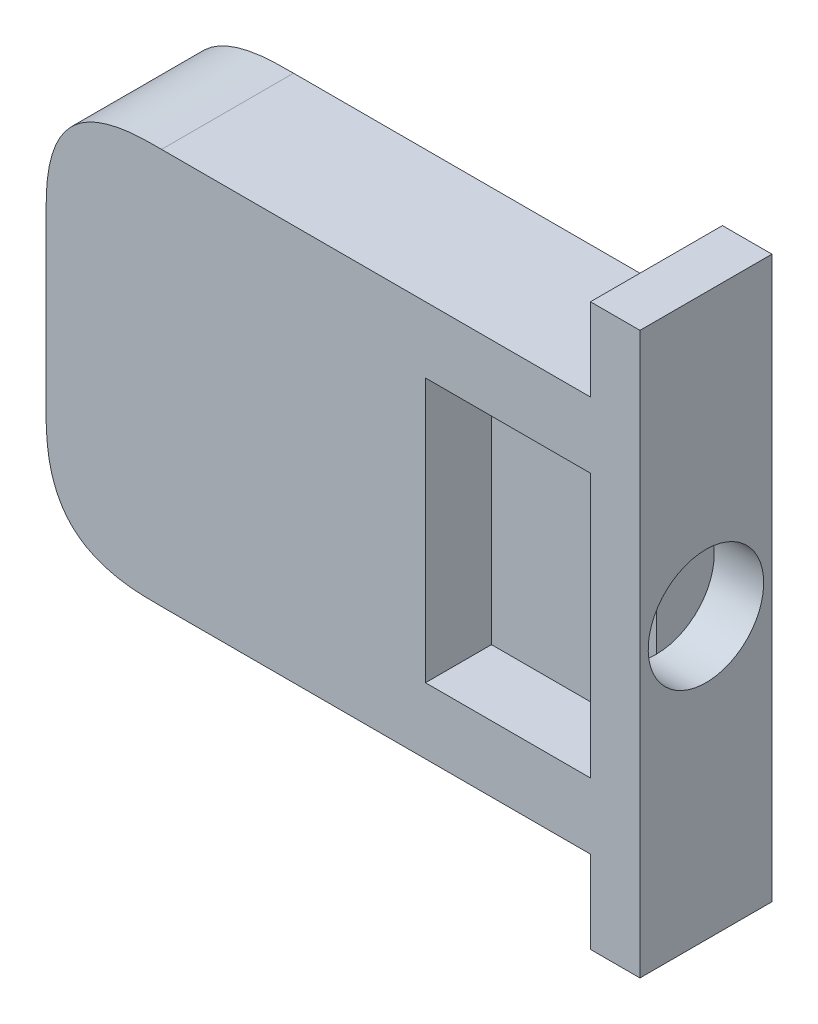
ISO-10303-21;
HEADER;
FILE_DESCRIPTION(('STEP AP214'),'2;1');
FILE_NAME('part.step','',(''),(''),'','','');
FILE_SCHEMA(('AUTOMOTIVE_DESIGN { 1 0 10303 214 1 1 1 1 }'));
ENDSEC;
DATA;
#1=APPLICATION_CONTEXT('core data for automotive mechanical design processes');
#2=APPLICATION_PROTOCOL_DEFINITION('international standard','automotive_design',2000,#1);
#3=PRODUCT_CONTEXT('',#1,'mechanical');
#4=PRODUCT('Part','Part','',(#3));
#5=PRODUCT_RELATED_PRODUCT_CATEGORY('part','',(#4));
#6=PRODUCT_DEFINITION_FORMATION('','',#4);
#7=PRODUCT_DEFINITION_CONTEXT('part definition',#1,'design');
#8=PRODUCT_DEFINITION('design','',#6,#7);
#9=PRODUCT_DEFINITION_SHAPE('','',#8);
#10=(LENGTH_UNIT() NAMED_UNIT(*) SI_UNIT(.MILLI.,.METRE.));
#11=(NAMED_UNIT(*) PLANE_ANGLE_UNIT() SI_UNIT($,.RADIAN.));
#12=(NAMED_UNIT(*) SI_UNIT($,.STERADIAN.) SOLID_ANGLE_UNIT());
#13=UNCERTAINTY_MEASURE_WITH_UNIT(LENGTH_MEASURE(1.E-05),#10,'distance_accuracy_value','');
#14=(GEOMETRIC_REPRESENTATION_CONTEXT(3) GLOBAL_UNCERTAINTY_ASSIGNED_CONTEXT((#13)) GLOBAL_UNIT_ASSIGNED_CONTEXT((#10,
#11,#12)) REPRESENTATION_CONTEXT('',''));
#15=CARTESIAN_POINT('',(0.,0.,0.));
#16=DIRECTION('',(0.,0.,1.));
#17=DIRECTION('',(1.,0.,0.));
#18=AXIS2_PLACEMENT_3D('',#15,#16,#17);
#19=CARTESIAN_POINT('',(0.,0.,8.));
#20=DIRECTION('',(0.,0.,-1.));
#21=DIRECTION('',(-1.,0.,0.));
#22=AXIS2_PLACEMENT_3D('',#19,#20,#21);
#23=PLANE('',#22);
#24=DIRECTION('',(1.,0.,0.));
#25=VECTOR('',#24,1.);
#26=CARTESIAN_POINT('',(-6.,12.,8.));
#27=LINE('',#26,#25);
#28=CARTESIAN_POINT('',(0.999999999999998,12.,8.));
#29=VERTEX_POINT('',#28);
#30=CARTESIAN_POINT('',(27.,12.,8.));
#31=VERTEX_POINT('',#30);
#32=EDGE_CURVE('E432',#29,#31,#27,.T.);
#33=ORIENTED_EDGE('',*,*,#32,.F.);
#34=CARTESIAN_POINT('',(-6.,5.,8.));
#35=CARTESIAN_POINT('',(-6.,6.17738636073763,8.));
#36=CARTESIAN_POINT('',(-6.,7.35477272147525,8.));
#37=CARTESIAN_POINT('',(-5.49815656114742,9.94974746830584,8.));
#38=CARTESIAN_POINT('',(-3.94974746830583,11.4981565611474,8.));
#39=CARTESIAN_POINT('',(-1.35477272147525,12.,8.));
#40=CARTESIAN_POINT('',(-0.177386360737627,12.,8.));
#41=CARTESIAN_POINT('',(0.999999999999998,12.,8.));
#42=B_SPLINE_CURVE_WITH_KNOTS('',5,(#34,#35,#36,#37,#38,#39,#40,#41),.UNSPECIFIED.,.F.,.F.,(6,2,
6),(0.,0.5,1.),.UNSPECIFIED.);
#43=CARTESIAN_POINT('',(-6.,5.,8.));
#44=VERTEX_POINT('',#43);
#45=EDGE_CURVE('E53',#29,#44,#42,.F.);
#46=ORIENTED_EDGE('',*,*,#45,.T.);
#47=DIRECTION('',(0.,1.,0.));
#48=VECTOR('',#47,1.);
#49=CARTESIAN_POINT('',(-6.,-12.,8.));
#50=LINE('',#49,#48);
#51=CARTESIAN_POINT('',(-6.,-5.,8.));
#52=VERTEX_POINT('',#51);
#53=EDGE_CURVE('E222',#52,#44,#50,.T.);
#54=ORIENTED_EDGE('',*,*,#53,.F.);
#55=CARTESIAN_POINT('',(0.999999999999998,-12.,8.));
#56=CARTESIAN_POINT('',(-0.177386360737628,-12.,8.));
#57=CARTESIAN_POINT('',(-1.35477272147525,-12.,8.));
#58=CARTESIAN_POINT('',(-3.94974746830584,-11.4981565611474,8.));
#59=CARTESIAN_POINT('',(-5.49815656114742,-9.94974746830584,8.));
#60=CARTESIAN_POINT('',(-6.,-7.35477272147525,8.));
#61=CARTESIAN_POINT('',(-6.,-6.17738636073763,8.));
#62=CARTESIAN_POINT('',(-6.,-5.,8.));
#63=B_SPLINE_CURVE_WITH_KNOTS('',5,(#55,#56,#57,#58,#59,#60,#61,#62),.UNSPECIFIED.,.F.,.F.,(6,2,
6),(0.,0.5,1.),.UNSPECIFIED.);
#64=CARTESIAN_POINT('',(0.999999999999998,-12.,8.));
#65=VERTEX_POINT('',#64);
#66=EDGE_CURVE('E231',#52,#65,#63,.F.);
#67=ORIENTED_EDGE('',*,*,#66,.T.);
#68=DIRECTION('',(1.,0.,0.));
#69=VECTOR('',#68,1.);
#70=CARTESIAN_POINT('',(-6.,-12.,8.));
#71=LINE('',#70,#69);
#72=CARTESIAN_POINT('',(27.,-12.,8.));
#73=VERTEX_POINT('',#72);
#74=EDGE_CURVE('E214',#65,#73,#71,.T.);
#75=ORIENTED_EDGE('',*,*,#74,.T.);
#76=DIRECTION('',(0.,-1.,0.));
#77=VECTOR('',#76,1.);
#78=CARTESIAN_POINT('',(27.,-12.,8.));
#79=LINE('',#78,#77);
#80=CARTESIAN_POINT('',(27.,-17.,8.));
#81=VERTEX_POINT('',#80);
#82=EDGE_CURVE('E212',#73,#81,#79,.T.);
#83=ORIENTED_EDGE('',*,*,#82,.T.);
#84=DIRECTION('',(1.,0.,0.));
#85=VECTOR('',#84,1.);
#86=CARTESIAN_POINT('',(27.,-17.,8.));
#87=LINE('',#86,#85);
#88=CARTESIAN_POINT('',(30.,-17.,8.));
#89=VERTEX_POINT('',#88);
#90=EDGE_CURVE('E210',#81,#89,#87,.T.);
#91=ORIENTED_EDGE('',*,*,#90,.T.);
#92=DIRECTION('',(0.,-1.,0.));
#93=VECTOR('',#92,1.);
#94=CARTESIAN_POINT('',(30.,17.,8.));
#95=LINE('',#94,#93);
#96=CARTESIAN_POINT('',(30.,17.,8.));
#97=VERTEX_POINT('',#96);
#98=EDGE_CURVE('E206',#97,#89,#95,.T.);
#99=ORIENTED_EDGE('',*,*,#98,.F.);
#100=DIRECTION('',(1.,0.,0.));
#101=VECTOR('',#100,1.);
#102=CARTESIAN_POINT('',(27.,17.,8.));
#103=LINE('',#102,#101);
#104=CARTESIAN_POINT('',(27.,17.,8.));
#105=VERTEX_POINT('',#104);
#106=EDGE_CURVE('E203',#105,#97,#103,.T.);
#107=ORIENTED_EDGE('',*,*,#106,.F.);
#108=DIRECTION('',(0.,1.,0.));
#109=VECTOR('',#108,1.);
#110=CARTESIAN_POINT('',(27.,12.,8.));
#111=LINE('',#110,#109);
#112=EDGE_CURVE('E400',#31,#105,#111,.T.);
#113=ORIENTED_EDGE('',*,*,#112,.F.);
#114=EDGE_LOOP('',(#33,#46,#54,#67,#75,#83,#91,#99,#107,#113));
#115=FACE_BOUND('',#114,.T.);
#116=DIRECTION('',(0.,-1.,0.));
#117=VECTOR('',#116,1.);
#118=CARTESIAN_POINT('',(27.,0.,8.));
#119=LINE('',#118,#117);
#120=CARTESIAN_POINT('',(27.,8.,8.));
#121=VERTEX_POINT('',#120);
#122=CARTESIAN_POINT('',(27.,-8.,8.));
#123=VERTEX_POINT('',#122);
#124=EDGE_CURVE('E67',#121,#123,#119,.T.);
#125=ORIENTED_EDGE('',*,*,#124,.T.);
#126=DIRECTION('',(1.,0.,0.));
#127=VECTOR('',#126,1.);
#128=CARTESIAN_POINT('',(0.,-8.,8.));
#129=LINE('',#128,#127);
#130=CARTESIAN_POINT('',(17.,-8.,8.));
#131=VERTEX_POINT('',#130);
#132=EDGE_CURVE('E174',#131,#123,#129,.T.);
#133=ORIENTED_EDGE('',*,*,#132,.F.);
#134=DIRECTION('',(0.,1.,0.));
#135=VECTOR('',#134,1.);
#136=CARTESIAN_POINT('',(17.,0.,8.));
#137=LINE('',#136,#135);
#138=CARTESIAN_POINT('',(17.,8.,8.));
#139=VERTEX_POINT('',#138);
#140=EDGE_CURVE('E176',#131,#139,#137,.T.);
#141=ORIENTED_EDGE('',*,*,#140,.T.);
#142=DIRECTION('',(1.,0.,0.));
#143=VECTOR('',#142,1.);
#144=CARTESIAN_POINT('',(0.,8.,8.));
#145=LINE('',#144,#143);
#146=EDGE_CURVE('E190',#139,#121,#145,.T.);
#147=ORIENTED_EDGE('',*,*,#146,.T.);
#148=EDGE_LOOP('',(#125,#133,#141,#147));
#149=FACE_BOUND('',#148,.T.);
#150=ADVANCED_FACE('F39',(#115,#149),#23,.F.);
#151=CARTESIAN_POINT('',(27.,17.,8.));
#152=DIRECTION('',(0.,1.,0.));
#153=DIRECTION('',(0.,0.,1.));
#154=AXIS2_PLACEMENT_3D('',#151,#152,#153);
#155=PLANE('',#154);
#156=DIRECTION('',(1.,0.,0.));
#157=VECTOR('',#156,1.);
#158=CARTESIAN_POINT('',(27.,17.,0.));
#159=LINE('',#158,#157);
#160=CARTESIAN_POINT('',(27.,17.,0.));
#161=VERTEX_POINT('',#160);
#162=CARTESIAN_POINT('',(30.,17.,0.));
#163=VERTEX_POINT('',#162);
#164=EDGE_CURVE('E197',#161,#163,#159,.T.);
#165=ORIENTED_EDGE('',*,*,#164,.F.);
#166=DIRECTION('',(0.,0.,-1.));
#167=VECTOR('',#166,1.);
#168=CARTESIAN_POINT('',(27.,17.,8.));
#169=LINE('',#168,#167);
#170=EDGE_CURVE('E377',#105,#161,#169,.T.);
#171=ORIENTED_EDGE('',*,*,#170,.F.);
#172=ORIENTED_EDGE('',*,*,#106,.T.);
#173=DIRECTION('',(0.,0.,-1.));
#174=VECTOR('',#173,1.);
#175=CARTESIAN_POINT('',(30.,17.,8.));
#176=LINE('',#175,#174);
#177=EDGE_CURVE('E398',#97,#163,#176,.T.);
#178=ORIENTED_EDGE('',*,*,#177,.T.);
#179=EDGE_LOOP('',(#165,#171,#172,#178));
#180=FACE_BOUND('',#179,.T.);
#181=ADVANCED_FACE('F247',(#180),#155,.T.);
#182=CARTESIAN_POINT('',(27.,12.,8.));
#183=DIRECTION('',(-1.,0.,0.));
#184=DIRECTION('',(0.,0.,1.));
#185=AXIS2_PLACEMENT_3D('',#182,#183,#184);
#186=PLANE('',#185);
#187=DIRECTION('',(0.,1.,0.));
#188=VECTOR('',#187,1.);
#189=CARTESIAN_POINT('',(27.,12.,0.));
#190=LINE('',#189,#188);
#191=CARTESIAN_POINT('',(27.,12.,0.));
#192=VERTEX_POINT('',#191);
#193=EDGE_CURVE('E207',#192,#161,#190,.T.);
#194=ORIENTED_EDGE('',*,*,#193,.F.);
#195=DIRECTION('',(0.,0.,-1.));
#196=VECTOR('',#195,1.);
#197=CARTESIAN_POINT('',(27.,12.,8.));
#198=LINE('',#197,#196);
#199=EDGE_CURVE('E379',#31,#192,#198,.T.);
#200=ORIENTED_EDGE('',*,*,#199,.F.);
#201=ORIENTED_EDGE('',*,*,#112,.T.);
#202=ORIENTED_EDGE('',*,*,#170,.T.);
#203=EDGE_LOOP('',(#194,#200,#201,#202));
#204=FACE_BOUND('',#203,.T.);
#205=ADVANCED_FACE('F295',(#204),#186,.T.);
#206=CARTESIAN_POINT('',(-6.,12.,8.));
#207=DIRECTION('',(0.,1.,0.));
#208=DIRECTION('',(0.,0.,1.));
#209=AXIS2_PLACEMENT_3D('',#206,#207,#208);
#210=PLANE('',#209);
#211=DIRECTION('',(1.,0.,0.));
#212=VECTOR('',#211,1.);
#213=CARTESIAN_POINT('',(-6.,12.,0.));
#214=LINE('',#213,#212);
#215=CARTESIAN_POINT('',(0.999999999999998,12.,0.));
#216=VERTEX_POINT('',#215);
#217=EDGE_CURVE('E405',#216,#192,#214,.T.);
#218=ORIENTED_EDGE('',*,*,#217,.F.);
#219=CARTESIAN_POINT('',(0.999999999999998,12.,8.4));
#220=CARTESIAN_POINT('',(0.999999999999998,12.,5.46666666666889));
#221=CARTESIAN_POINT('',(0.999999999999998,12.,2.53333333333333));
#222=CARTESIAN_POINT('',(0.999999999999998,12.,-0.400000000000001));
#223=B_SPLINE_CURVE_WITH_KNOTS('',3,(#219,#220,#221,#222),.UNSPECIFIED.,.F.,.F.,(4,4),(-0.0004,
0.0084),.UNSPECIFIED.);
#224=EDGE_CURVE('E333',#216,#29,#223,.F.);
#225=ORIENTED_EDGE('',*,*,#224,.T.);
#226=ORIENTED_EDGE('',*,*,#32,.T.);
#227=ORIENTED_EDGE('',*,*,#199,.T.);
#228=EDGE_LOOP('',(#218,#225,#226,#227));
#229=FACE_BOUND('',#228,.T.);
#230=ADVANCED_FACE('F467',(#229),#210,.T.);
#231=CARTESIAN_POINT('',(-6.,-12.,8.));
#232=DIRECTION('',(-1.,0.,0.));
#233=DIRECTION('',(0.,0.,1.));
#234=AXIS2_PLACEMENT_3D('',#231,#232,#233);
#235=PLANE('',#234);
#236=ORIENTED_EDGE('',*,*,#53,.T.);
#237=CARTESIAN_POINT('',(-6.,5.,-0.400000000000001));
#238=CARTESIAN_POINT('',(-6.,5.,2.53333333333333));
#239=CARTESIAN_POINT('',(-6.,5.,5.46666666666889));
#240=CARTESIAN_POINT('',(-6.,5.,8.4));
#241=B_SPLINE_CURVE_WITH_KNOTS('',3,(#237,#238,#239,#240),.UNSPECIFIED.,.F.,.F.,(4,4),
(-0.000399999999999999,0.0084),.UNSPECIFIED.);
#242=CARTESIAN_POINT('',(-6.,5.,0.));
#243=VERTEX_POINT('',#242);
#244=EDGE_CURVE('E376',#44,#243,#241,.F.);
#245=ORIENTED_EDGE('',*,*,#244,.T.);
#246=DIRECTION('',(0.,1.,0.));
#247=VECTOR('',#246,1.);
#248=CARTESIAN_POINT('',(-6.,-12.,0.));
#249=LINE('',#248,#247);
#250=CARTESIAN_POINT('',(-6.,-5.,0.));
#251=VERTEX_POINT('',#250);
#252=EDGE_CURVE('E401',#251,#243,#249,.T.);
#253=ORIENTED_EDGE('',*,*,#252,.F.);
#254=CARTESIAN_POINT('',(-6.,-5.,8.4));
#255=CARTESIAN_POINT('',(-6.,-5.,5.46666666667144));
#256=CARTESIAN_POINT('',(-6.,-5.,2.53333333333333));
#257=CARTESIAN_POINT('',(-6.,-5.,-0.399999999999999));
#258=B_SPLINE_CURVE_WITH_KNOTS('',3,(#254,#255,#256,#257),.UNSPECIFIED.,.F.,.F.,(4,4),(-0.0084,
0.000399999999999999),.UNSPECIFIED.);
#259=EDGE_CURVE('E371',#251,#52,#258,.F.);
#260=ORIENTED_EDGE('',*,*,#259,.T.);
#261=EDGE_LOOP('',(#236,#245,#253,#260));
#262=FACE_BOUND('',#261,.T.);
#263=ADVANCED_FACE('F281',(#262),#235,.T.);
#264=CARTESIAN_POINT('',(-6.,-12.,8.));
#265=DIRECTION('',(0.,1.,0.));
#266=DIRECTION('',(0.,0.,1.));
#267=AXIS2_PLACEMENT_3D('',#264,#265,#266);
#268=PLANE('',#267);
#269=ORIENTED_EDGE('',*,*,#74,.F.);
#270=CARTESIAN_POINT('',(0.999999999999998,-12.,-0.399999999999999));
#271=CARTESIAN_POINT('',(0.999999999999998,-12.,2.53333333333333));
#272=CARTESIAN_POINT('',(0.999999999999998,-12.,5.46666666667144));
#273=CARTESIAN_POINT('',(0.999999999999998,-12.,8.4));
#274=B_SPLINE_CURVE_WITH_KNOTS('',3,(#270,#271,#272,#273),.UNSPECIFIED.,.F.,.F.,(4,4),(-0.0084,
0.0004),.UNSPECIFIED.);
#275=CARTESIAN_POINT('',(0.999999999999998,-12.,0.));
#276=VERTEX_POINT('',#275);
#277=EDGE_CURVE('E11',#65,#276,#274,.F.);
#278=ORIENTED_EDGE('',*,*,#277,.T.);
#279=DIRECTION('',(1.,0.,0.));
#280=VECTOR('',#279,1.);
#281=CARTESIAN_POINT('',(-6.,-12.,0.));
#282=LINE('',#281,#280);
#283=CARTESIAN_POINT('',(27.,-12.,0.));
#284=VERTEX_POINT('',#283);
#285=EDGE_CURVE('E406',#276,#284,#282,.T.);
#286=ORIENTED_EDGE('',*,*,#285,.T.);
#287=DIRECTION('',(0.,0.,-1.));
#288=VECTOR('',#287,1.);
#289=CARTESIAN_POINT('',(27.,-12.,8.));
#290=LINE('',#289,#288);
#291=EDGE_CURVE('E386',#73,#284,#290,.T.);
#292=ORIENTED_EDGE('',*,*,#291,.F.);
#293=EDGE_LOOP('',(#269,#278,#286,#292));
#294=FACE_BOUND('',#293,.T.);
#295=ADVANCED_FACE('F270',(#294),#268,.F.);
#296=CARTESIAN_POINT('',(27.,-12.,8.));
#297=DIRECTION('',(1.,0.,0.));
#298=DIRECTION('',(0.,0.,-1.));
#299=AXIS2_PLACEMENT_3D('',#296,#297,#298);
#300=PLANE('',#299);
#301=DIRECTION('',(0.,-1.,0.));
#302=VECTOR('',#301,1.);
#303=CARTESIAN_POINT('',(27.,-12.,0.));
#304=LINE('',#303,#302);
#305=CARTESIAN_POINT('',(27.,-17.,0.));
#306=VERTEX_POINT('',#305);
#307=EDGE_CURVE('E448',#284,#306,#304,.T.);
#308=ORIENTED_EDGE('',*,*,#307,.T.);
#309=DIRECTION('',(0.,0.,-1.));
#310=VECTOR('',#309,1.);
#311=CARTESIAN_POINT('',(27.,-17.,8.));
#312=LINE('',#311,#310);
#313=EDGE_CURVE('E393',#81,#306,#312,.T.);
#314=ORIENTED_EDGE('',*,*,#313,.F.);
#315=ORIENTED_EDGE('',*,*,#82,.F.);
#316=ORIENTED_EDGE('',*,*,#291,.T.);
#317=EDGE_LOOP('',(#308,#314,#315,#316));
#318=FACE_BOUND('',#317,.T.);
#319=ADVANCED_FACE('F280',(#318),#300,.F.);
#320=CARTESIAN_POINT('',(27.,-17.,8.));
#321=DIRECTION('',(0.,1.,0.));
#322=DIRECTION('',(-1.,0.,0.));
#323=AXIS2_PLACEMENT_3D('',#320,#321,#322);
#324=PLANE('',#323);
#325=DIRECTION('',(1.,0.,0.));
#326=VECTOR('',#325,1.);
#327=CARTESIAN_POINT('',(27.,-17.,0.));
#328=LINE('',#327,#326);
#329=CARTESIAN_POINT('',(30.,-17.,0.));
#330=VERTEX_POINT('',#329);
#331=EDGE_CURVE('E446',#306,#330,#328,.T.);
#332=ORIENTED_EDGE('',*,*,#331,.T.);
#333=DIRECTION('',(0.,0.,-1.));
#334=VECTOR('',#333,1.);
#335=CARTESIAN_POINT('',(30.,-17.,8.));
#336=LINE('',#335,#334);
#337=EDGE_CURVE('E396',#89,#330,#336,.T.);
#338=ORIENTED_EDGE('',*,*,#337,.F.);
#339=ORIENTED_EDGE('',*,*,#90,.F.);
#340=ORIENTED_EDGE('',*,*,#313,.T.);
#341=EDGE_LOOP('',(#332,#338,#339,#340));
#342=FACE_BOUND('',#341,.T.);
#343=ADVANCED_FACE('F285',(#342),#324,.F.);
#344=CARTESIAN_POINT('',(30.,17.,8.));
#345=DIRECTION('',(1.,0.,0.));
#346=DIRECTION('',(0.,1.,0.));
#347=AXIS2_PLACEMENT_3D('',#344,#345,#346);
#348=PLANE('',#347);
#349=CARTESIAN_POINT('',(30.,0.,4.));
#350=DIRECTION('',(1.,0.,0.));
#351=DIRECTION('',(0.,1.,0.));
#352=AXIS2_PLACEMENT_3D('',#349,#350,#351);
#353=CIRCLE('',#352,3.5);
#354=CARTESIAN_POINT('',(30.,3.50000000000001,4.));
#355=VERTEX_POINT('',#354);
#356=EDGE_CURVE('E165',#355,#355,#353,.T.);
#357=ORIENTED_EDGE('',*,*,#356,.F.);
#358=EDGE_LOOP('',(#357));
#359=FACE_BOUND('',#358,.T.);
#360=DIRECTION('',(0.,-1.,0.));
#361=VECTOR('',#360,1.);
#362=CARTESIAN_POINT('',(30.,17.,0.));
#363=LINE('',#362,#361);
#364=EDGE_CURVE('E443',#163,#330,#363,.T.);
#365=ORIENTED_EDGE('',*,*,#364,.F.);
#366=ORIENTED_EDGE('',*,*,#177,.F.);
#367=ORIENTED_EDGE('',*,*,#98,.T.);
#368=ORIENTED_EDGE('',*,*,#337,.T.);
#369=EDGE_LOOP('',(#365,#366,#367,#368));
#370=FACE_BOUND('',#369,.T.);
#371=ADVANCED_FACE('F289',(#359,#370),#348,.T.);
#372=CARTESIAN_POINT('',(0.,0.,0.));
#373=DIRECTION('',(0.,0.,-1.));
#374=DIRECTION('',(-1.,0.,0.));
#375=AXIS2_PLACEMENT_3D('',#372,#373,#374);
#376=PLANE('',#375);
#377=ORIENTED_EDGE('',*,*,#252,.T.);
#378=CARTESIAN_POINT('',(0.999999999999998,12.,0.));
#379=CARTESIAN_POINT('',(-0.177386360737627,12.,0.));
#380=CARTESIAN_POINT('',(-1.35477272147525,12.,0.));
#381=CARTESIAN_POINT('',(-3.94974746830583,11.4981565611474,0.));
#382=CARTESIAN_POINT('',(-5.49815656114742,9.94974746830584,0.));
#383=CARTESIAN_POINT('',(-6.,7.35477272147525,0.));
#384=CARTESIAN_POINT('',(-6.,6.17738636073763,0.));
#385=CARTESIAN_POINT('',(-6.,5.,0.));
#386=B_SPLINE_CURVE_WITH_KNOTS('',5,(#378,#379,#380,#381,#382,#383,#384,#385),.UNSPECIFIED.,.F.,
.F.,(6,2,6),(0.,0.5,1.),.UNSPECIFIED.);
#387=EDGE_CURVE('E427',#243,#216,#386,.F.);
#388=ORIENTED_EDGE('',*,*,#387,.T.);
#389=ORIENTED_EDGE('',*,*,#217,.T.);
#390=ORIENTED_EDGE('',*,*,#193,.T.);
#391=ORIENTED_EDGE('',*,*,#164,.T.);
#392=ORIENTED_EDGE('',*,*,#364,.T.);
#393=ORIENTED_EDGE('',*,*,#331,.F.);
#394=ORIENTED_EDGE('',*,*,#307,.F.);
#395=ORIENTED_EDGE('',*,*,#285,.F.);
#396=CARTESIAN_POINT('',(-6.,-5.,0.));
#397=CARTESIAN_POINT('',(-6.,-6.17738636073763,0.));
#398=CARTESIAN_POINT('',(-6.,-7.35477272147526,0.));
#399=CARTESIAN_POINT('',(-5.49815656114742,-9.94974746830584,0.));
#400=CARTESIAN_POINT('',(-3.94974746830584,-11.4981565611474,0.));
#401=CARTESIAN_POINT('',(-1.35477272147525,-12.,0.));
#402=CARTESIAN_POINT('',(-0.177386360737628,-12.,0.));
#403=CARTESIAN_POINT('',(0.999999999999998,-12.,0.));
#404=B_SPLINE_CURVE_WITH_KNOTS('',5,(#396,#397,#398,#399,#400,#401,#402,#403),.UNSPECIFIED.,.F.,
.F.,(6,2,6),(0.,0.5,1.),.UNSPECIFIED.);
#405=EDGE_CURVE('E345',#276,#251,#404,.F.);
#406=ORIENTED_EDGE('',*,*,#405,.T.);
#407=EDGE_LOOP('',(#377,#388,#389,#390,#391,#392,#393,#394,#395,#406));
#408=FACE_BOUND('',#407,.T.);
#409=ADVANCED_FACE('F249',(#408),#376,.T.);
#410=CARTESIAN_POINT('',(-6.,5.,8.4));
#411=CARTESIAN_POINT('',(-6.,5.,5.46666666666889));
#412=CARTESIAN_POINT('',(-6.,5.,2.53333333333333));
#413=CARTESIAN_POINT('',(-6.,5.,-0.400000000000001));
#414=CARTESIAN_POINT('',(-6.,6.17738636073763,8.4));
#415=CARTESIAN_POINT('',(-6.,6.17738636073763,5.46666666666889));
#416=CARTESIAN_POINT('',(-6.,6.17738636073763,2.53333333333333));
#417=CARTESIAN_POINT('',(-6.,6.17738636073763,-0.400000000000001));
#418=CARTESIAN_POINT('',(-6.,7.35477272147525,8.4));
#419=CARTESIAN_POINT('',(-6.,7.35477272147525,5.46666666666889));
#420=CARTESIAN_POINT('',(-6.,7.35477272147525,2.53333333333333));
#421=CARTESIAN_POINT('',(-6.,7.35477272147525,-0.400000000000001));
#422=CARTESIAN_POINT('',(-5.49815656114742,9.94974746830584,8.4));
#423=CARTESIAN_POINT('',(-5.49815656114742,9.94974746830584,5.46666666666889));
#424=CARTESIAN_POINT('',(-5.49815656114742,9.94974746830584,2.53333333333333));
#425=CARTESIAN_POINT('',(-5.49815656114742,9.94974746830584,-0.400000000000001));
#426=CARTESIAN_POINT('',(-3.94974746830583,11.4981565611474,8.4));
#427=CARTESIAN_POINT('',(-3.94974746830583,11.4981565611474,5.46666666666889));
#428=CARTESIAN_POINT('',(-3.94974746830583,11.4981565611474,2.53333333333333));
#429=CARTESIAN_POINT('',(-3.94974746830583,11.4981565611474,-0.400000000000001));
#430=CARTESIAN_POINT('',(-1.35477272147525,12.,8.4));
#431=CARTESIAN_POINT('',(-1.35477272147525,12.,5.46666666666889));
#432=CARTESIAN_POINT('',(-1.35477272147525,12.,2.53333333333333));
#433=CARTESIAN_POINT('',(-1.35477272147525,12.,-0.400000000000001));
#434=CARTESIAN_POINT('',(-0.177386360737627,12.,8.4));
#435=CARTESIAN_POINT('',(-0.177386360737627,12.,5.46666666666889));
#436=CARTESIAN_POINT('',(-0.177386360737627,12.,2.53333333333333));
#437=CARTESIAN_POINT('',(-0.177386360737627,12.,-0.400000000000001));
#438=CARTESIAN_POINT('',(0.999999999999998,12.,8.4));
#439=CARTESIAN_POINT('',(0.999999999999998,12.,5.46666666666889));
#440=CARTESIAN_POINT('',(0.999999999999998,12.,2.53333333333333));
#441=CARTESIAN_POINT('',(0.999999999999998,12.,-0.400000000000001));
#442=B_SPLINE_SURFACE_WITH_KNOTS('',5,3,((#410,#411,#412,#413),(#414,#415,#416,#417),(#418,#419,
#420,#421),(#422,#423,#424,#425),(#426,#427,#428,#429),(#430,#431,#432,#433),(#434,#435,#436,
#437),(#438,#439,#440,#441)),.UNSPECIFIED.,.F.,.F.,.F.,(6,2,6),(4,4),(0.,0.5,1.),(-0.0004,
0.0084),.UNSPECIFIED.);
#443=ORIENTED_EDGE('',*,*,#45,.F.);
#444=ORIENTED_EDGE('',*,*,#224,.F.);
#445=ORIENTED_EDGE('',*,*,#387,.F.);
#446=ORIENTED_EDGE('',*,*,#244,.F.);
#447=EDGE_LOOP('',(#443,#444,#445,#446));
#448=FACE_BOUND('',#447,.T.);
#449=ADVANCED_FACE('F298',(#448),#442,.T.);
#450=CARTESIAN_POINT('',(-6.,-5.,-0.399999999999999));
#451=CARTESIAN_POINT('',(-6.,-5.,2.53333333333333));
#452=CARTESIAN_POINT('',(-6.,-5.,5.46666666667144));
#453=CARTESIAN_POINT('',(-6.,-5.,8.4));
#454=CARTESIAN_POINT('',(-6.,-6.17738636073763,-0.399999999999999));
#455=CARTESIAN_POINT('',(-6.,-6.17738636073763,2.53333333333333));
#456=CARTESIAN_POINT('',(-6.,-6.17738636073763,5.46666666667144));
#457=CARTESIAN_POINT('',(-6.,-6.17738636073763,8.4));
#458=CARTESIAN_POINT('',(-6.,-7.35477272147525,-0.399999999999999));
#459=CARTESIAN_POINT('',(-6.,-7.35477272147525,2.53333333333333));
#460=CARTESIAN_POINT('',(-6.,-7.35477272147525,5.46666666667144));
#461=CARTESIAN_POINT('',(-6.,-7.35477272147525,8.4));
#462=CARTESIAN_POINT('',(-5.49815656114742,-9.94974746830584,-0.399999999999999));
#463=CARTESIAN_POINT('',(-5.49815656114742,-9.94974746830584,2.53333333333333));
#464=CARTESIAN_POINT('',(-5.49815656114742,-9.94974746830584,5.46666666667144));
#465=CARTESIAN_POINT('',(-5.49815656114742,-9.94974746830584,8.4));
#466=CARTESIAN_POINT('',(-3.94974746830584,-11.4981565611474,-0.399999999999999));
#467=CARTESIAN_POINT('',(-3.94974746830584,-11.4981565611474,2.53333333333333));
#468=CARTESIAN_POINT('',(-3.94974746830584,-11.4981565611474,5.46666666667144));
#469=CARTESIAN_POINT('',(-3.94974746830584,-11.4981565611474,8.4));
#470=CARTESIAN_POINT('',(-1.35477272147525,-12.,-0.399999999999999));
#471=CARTESIAN_POINT('',(-1.35477272147525,-12.,2.53333333333333));
#472=CARTESIAN_POINT('',(-1.35477272147525,-12.,5.46666666667144));
#473=CARTESIAN_POINT('',(-1.35477272147525,-12.,8.4));
#474=CARTESIAN_POINT('',(-0.177386360737628,-12.,-0.399999999999999));
#475=CARTESIAN_POINT('',(-0.177386360737628,-12.,2.53333333333333));
#476=CARTESIAN_POINT('',(-0.177386360737628,-12.,5.46666666667144));
#477=CARTESIAN_POINT('',(-0.177386360737628,-12.,8.4));
#478=CARTESIAN_POINT('',(0.999999999999998,-12.,-0.399999999999999));
#479=CARTESIAN_POINT('',(0.999999999999998,-12.,2.53333333333333));
#480=CARTESIAN_POINT('',(0.999999999999998,-12.,5.46666666667144));
#481=CARTESIAN_POINT('',(0.999999999999998,-12.,8.4));
#482=B_SPLINE_SURFACE_WITH_KNOTS('',5,3,((#450,#451,#452,#453),(#454,#455,#456,#457),(#458,#459,
#460,#461),(#462,#463,#464,#465),(#466,#467,#468,#469),(#470,#471,#472,#473),(#474,#475,#476,
#477),(#478,#479,#480,#481)),.UNSPECIFIED.,.F.,.F.,.F.,(6,2,6),(4,4),(0.,0.5,1.),(-0.0084,
0.0004),.UNSPECIFIED.);
#483=ORIENTED_EDGE('',*,*,#66,.F.);
#484=ORIENTED_EDGE('',*,*,#259,.F.);
#485=ORIENTED_EDGE('',*,*,#405,.F.);
#486=ORIENTED_EDGE('',*,*,#277,.F.);
#487=EDGE_LOOP('',(#483,#484,#485,#486));
#488=FACE_BOUND('',#487,.T.);
#489=ADVANCED_FACE('F42',(#488),#482,.T.);
#490=CARTESIAN_POINT('',(27.,0.,4.));
#491=DIRECTION('',(-1.,0.,0.));
#492=DIRECTION('',(0.,0.,1.));
#493=AXIS2_PLACEMENT_3D('',#490,#491,#492);
#494=PLANE('',#493);
#495=CARTESIAN_POINT('',(27.,0.,4.));
#496=DIRECTION('',(1.,0.,0.));
#497=DIRECTION('',(0.,1.,0.));
#498=AXIS2_PLACEMENT_3D('',#495,#496,#497);
#499=CIRCLE('',#498,3.5);
#500=CARTESIAN_POINT('',(27.,3.50000000000001,4.));
#501=VERTEX_POINT('',#500);
#502=CARTESIAN_POINT('',(27.,-3.49999999999999,4.));
#503=VERTEX_POINT('',#502);
#504=EDGE_CURVE('E59',#501,#503,#499,.T.);
#505=ORIENTED_EDGE('',*,*,#504,.T.);
#506=DIRECTION('',(0.,-1.,0.));
#507=VECTOR('',#506,1.);
#508=CARTESIAN_POINT('',(27.,0.,4.));
#509=LINE('',#508,#507);
#510=CARTESIAN_POINT('',(27.,-8.,4.));
#511=VERTEX_POINT('',#510);
#512=EDGE_CURVE('E161',#503,#511,#509,.T.);
#513=ORIENTED_EDGE('',*,*,#512,.T.);
#514=DIRECTION('',(0.,0.,1.));
#515=VECTOR('',#514,1.);
#516=CARTESIAN_POINT('',(27.,-8.,4.));
#517=LINE('',#516,#515);
#518=EDGE_CURVE('E195',#511,#123,#517,.T.);
#519=ORIENTED_EDGE('',*,*,#518,.T.);
#520=ORIENTED_EDGE('',*,*,#124,.F.);
#521=DIRECTION('',(0.,0.,1.));
#522=VECTOR('',#521,1.);
#523=CARTESIAN_POINT('',(27.,8.,4.));
#524=LINE('',#523,#522);
#525=CARTESIAN_POINT('',(27.,8.,4.));
#526=VERTEX_POINT('',#525);
#527=EDGE_CURVE('E188',#526,#121,#524,.T.);
#528=ORIENTED_EDGE('',*,*,#527,.F.);
#529=EDGE_CURVE('E160',#526,#501,#509,.T.);
#530=ORIENTED_EDGE('',*,*,#529,.T.);
#531=EDGE_LOOP('',(#505,#513,#519,#520,#528,#530));
#532=FACE_BOUND('',#531,.T.);
#533=ADVANCED_FACE('F167',(#532),#494,.T.);
#534=CARTESIAN_POINT('',(0.,-8.,4.));
#535=DIRECTION('',(0.,-1.,0.));
#536=DIRECTION('',(0.,0.,-1.));
#537=AXIS2_PLACEMENT_3D('',#534,#535,#536);
#538=PLANE('',#537);
#539=ORIENTED_EDGE('',*,*,#132,.T.);
#540=ORIENTED_EDGE('',*,*,#518,.F.);
#541=DIRECTION('',(1.,0.,0.));
#542=VECTOR('',#541,1.);
#543=CARTESIAN_POINT('',(0.,-8.,4.));
#544=LINE('',#543,#542);
#545=CARTESIAN_POINT('',(17.,-8.,4.));
#546=VERTEX_POINT('',#545);
#547=EDGE_CURVE('E173',#546,#511,#544,.T.);
#548=ORIENTED_EDGE('',*,*,#547,.F.);
#549=DIRECTION('',(0.,0.,1.));
#550=VECTOR('',#549,1.);
#551=CARTESIAN_POINT('',(17.,-8.,4.));
#552=LINE('',#551,#550);
#553=EDGE_CURVE('E198',#546,#131,#552,.T.);
#554=ORIENTED_EDGE('',*,*,#553,.T.);
#555=EDGE_LOOP('',(#539,#540,#548,#554));
#556=FACE_BOUND('',#555,.T.);
#557=ADVANCED_FACE('F497',(#556),#538,.F.);
#558=CARTESIAN_POINT('',(17.,0.,4.));
#559=DIRECTION('',(1.,0.,0.));
#560=DIRECTION('',(0.,0.,-1.));
#561=AXIS2_PLACEMENT_3D('',#558,#559,#560);
#562=PLANE('',#561);
#563=ORIENTED_EDGE('',*,*,#140,.F.);
#564=ORIENTED_EDGE('',*,*,#553,.F.);
#565=DIRECTION('',(0.,1.,0.));
#566=VECTOR('',#565,1.);
#567=CARTESIAN_POINT('',(17.,0.,4.));
#568=LINE('',#567,#566);
#569=CARTESIAN_POINT('',(17.,8.,4.));
#570=VERTEX_POINT('',#569);
#571=EDGE_CURVE('E181',#546,#570,#568,.T.);
#572=ORIENTED_EDGE('',*,*,#571,.T.);
#573=DIRECTION('',(0.,0.,1.));
#574=VECTOR('',#573,1.);
#575=CARTESIAN_POINT('',(17.,8.,4.));
#576=LINE('',#575,#574);
#577=EDGE_CURVE('E200',#570,#139,#576,.T.);
#578=ORIENTED_EDGE('',*,*,#577,.T.);
#579=EDGE_LOOP('',(#563,#564,#572,#578));
#580=FACE_BOUND('',#579,.T.);
#581=ADVANCED_FACE('F502',(#580),#562,.T.);
#582=CARTESIAN_POINT('',(0.,8.,4.));
#583=DIRECTION('',(0.,-1.,0.));
#584=DIRECTION('',(0.,0.,-1.));
#585=AXIS2_PLACEMENT_3D('',#582,#583,#584);
#586=PLANE('',#585);
#587=ORIENTED_EDGE('',*,*,#146,.F.);
#588=ORIENTED_EDGE('',*,*,#577,.F.);
#589=DIRECTION('',(1.,0.,0.));
#590=VECTOR('',#589,1.);
#591=CARTESIAN_POINT('',(0.,8.,4.));
#592=LINE('',#591,#590);
#593=EDGE_CURVE('E180',#570,#526,#592,.T.);
#594=ORIENTED_EDGE('',*,*,#593,.T.);
#595=ORIENTED_EDGE('',*,*,#527,.T.);
#596=EDGE_LOOP('',(#587,#588,#594,#595));
#597=FACE_BOUND('',#596,.T.);
#598=ADVANCED_FACE('F515',(#597),#586,.T.);
#599=CARTESIAN_POINT('',(0.,0.,4.));
#600=DIRECTION('',(0.,0.,1.));
#601=DIRECTION('',(1.,0.,0.));
#602=AXIS2_PLACEMENT_3D('',#599,#600,#601);
#603=PLANE('',#602);
#604=ORIENTED_EDGE('',*,*,#529,.F.);
#605=ORIENTED_EDGE('',*,*,#593,.F.);
#606=ORIENTED_EDGE('',*,*,#571,.F.);
#607=ORIENTED_EDGE('',*,*,#547,.T.);
#608=ORIENTED_EDGE('',*,*,#512,.F.);
#609=EDGE_CURVE('E153',#501,#503,#509,.T.);
#610=ORIENTED_EDGE('',*,*,#609,.F.);
#611=EDGE_LOOP('',(#604,#605,#606,#607,#608,#610));
#612=FACE_BOUND('',#611,.T.);
#613=ADVANCED_FACE('F170',(#612),#603,.T.);
#614=CARTESIAN_POINT('',(27.,0.,4.));
#615=DIRECTION('',(1.,0.,0.));
#616=DIRECTION('',(0.,1.,0.));
#617=AXIS2_PLACEMENT_3D('',#614,#615,#616);
#618=CYLINDRICAL_SURFACE('',#617,3.5);
#619=ORIENTED_EDGE('',*,*,#504,.F.);
#620=EDGE_CURVE('E155',#503,#501,#499,.T.);
#621=ORIENTED_EDGE('',*,*,#620,.F.);
#622=EDGE_LOOP('',(#619,#621));
#623=FACE_BOUND('',#622,.T.);
#624=ORIENTED_EDGE('',*,*,#356,.T.);
#625=EDGE_LOOP('',(#624));
#626=FACE_BOUND('',#625,.T.);
#627=ADVANCED_FACE('F163',(#623,#626),#618,.F.);
#628=CARTESIAN_POINT('',(27.,0.,4.));
#629=DIRECTION('',(1.,0.,0.));
#630=DIRECTION('',(0.,1.,0.));
#631=AXIS2_PLACEMENT_3D('',#628,#629,#630);
#632=PLANE('',#631);
#633=ORIENTED_EDGE('',*,*,#620,.T.);
#634=ORIENTED_EDGE('',*,*,#609,.T.);
#635=EDGE_LOOP('',(#633,#634));
#636=FACE_BOUND('',#635,.T.);
#637=ADVANCED_FACE('F154',(#636),#632,.T.);
#638=CLOSED_SHELL('',(#150,#181,#205,#230,#263,#295,#319,#343,#371,#409,#449,#489,#533,#557,
#581,#598,#613,#627,#637));
#639=MANIFOLD_SOLID_BREP('B2',#638);
#640=ADVANCED_BREP_SHAPE_REPRESENTATION('',(#18,#639),#14);
#641=SHAPE_DEFINITION_REPRESENTATION(#9,#640);
ENDSEC;
END-ISO-10303-21;
